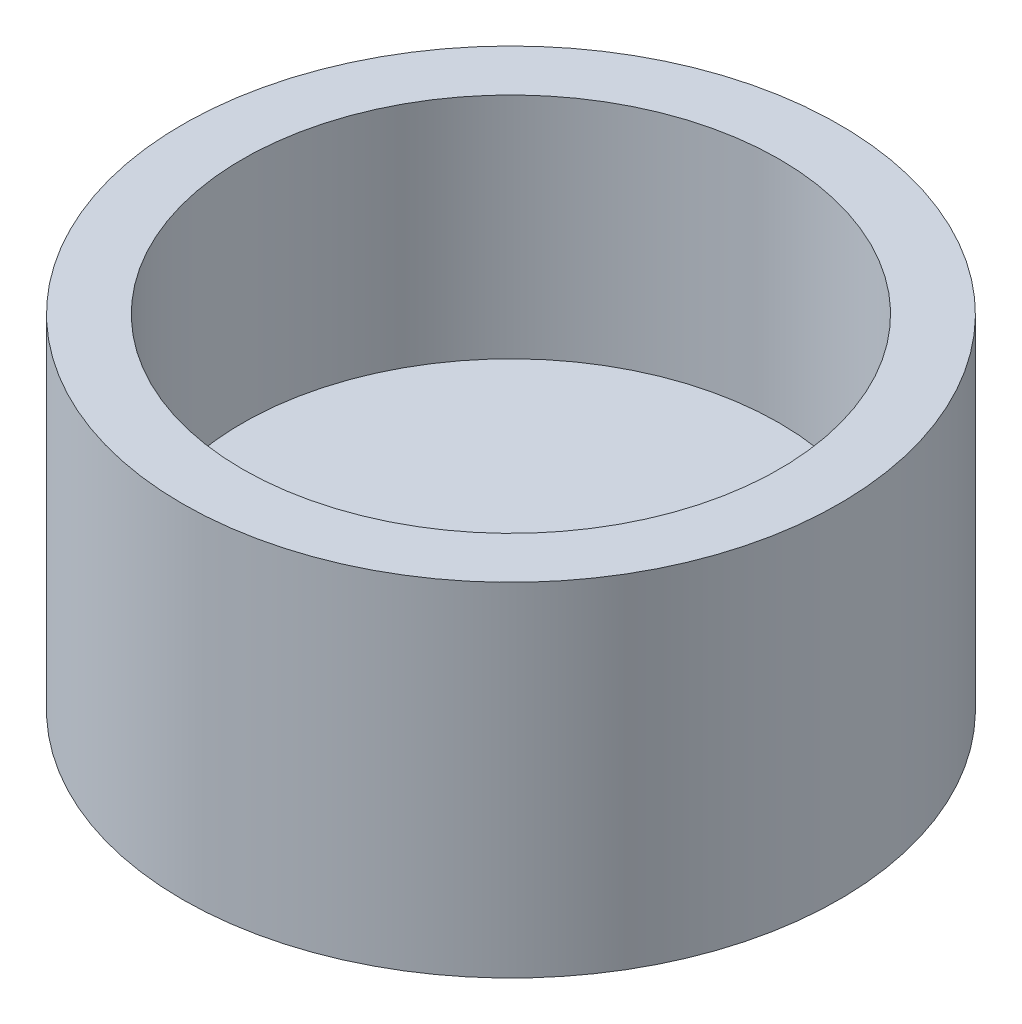
ISO-10303-21;
HEADER;
FILE_DESCRIPTION(('STEP AP214'),'2;1');
FILE_NAME('part.step','',(''),(''),'','','');
FILE_SCHEMA(('AUTOMOTIVE_DESIGN { 1 0 10303 214 1 1 1 1 }'));
ENDSEC;
DATA;
#1=APPLICATION_CONTEXT('core data for automotive mechanical design processes');
#2=APPLICATION_PROTOCOL_DEFINITION('international standard','automotive_design',2000,#1);
#3=PRODUCT_CONTEXT('',#1,'mechanical');
#4=PRODUCT('Part','Part','',(#3));
#5=PRODUCT_RELATED_PRODUCT_CATEGORY('part','',(#4));
#6=PRODUCT_DEFINITION_FORMATION('','',#4);
#7=PRODUCT_DEFINITION_CONTEXT('part definition',#1,'design');
#8=PRODUCT_DEFINITION('design','',#6,#7);
#9=PRODUCT_DEFINITION_SHAPE('','',#8);
#10=(LENGTH_UNIT() NAMED_UNIT(*) SI_UNIT(.MILLI.,.METRE.));
#11=(NAMED_UNIT(*) PLANE_ANGLE_UNIT() SI_UNIT($,.RADIAN.));
#12=(NAMED_UNIT(*) SI_UNIT($,.STERADIAN.) SOLID_ANGLE_UNIT());
#13=UNCERTAINTY_MEASURE_WITH_UNIT(LENGTH_MEASURE(1.E-05),#10,'distance_accuracy_value','');
#14=(GEOMETRIC_REPRESENTATION_CONTEXT(3) GLOBAL_UNCERTAINTY_ASSIGNED_CONTEXT((#13)) GLOBAL_UNIT_ASSIGNED_CONTEXT((#10,
#11,#12)) REPRESENTATION_CONTEXT('',''));
#15=CARTESIAN_POINT('',(0.,0.,0.));
#16=DIRECTION('',(0.,0.,1.));
#17=DIRECTION('',(1.,0.,0.));
#18=AXIS2_PLACEMENT_3D('',#15,#16,#17);
#19=CARTESIAN_POINT('',(0.,6.,0.));
#20=DIRECTION('',(0.,-1.,0.));
#21=DIRECTION('',(0.,0.,-1.));
#22=AXIS2_PLACEMENT_3D('',#19,#20,#21);
#23=CYLINDRICAL_SURFACE('',#22,5.75);
#24=CARTESIAN_POINT('',(0.,6.,0.));
#25=DIRECTION('',(0.,1.,0.));
#26=DIRECTION('',(0.,0.,1.));
#27=AXIS2_PLACEMENT_3D('',#24,#25,#26);
#28=CIRCLE('',#27,5.75);
#29=CARTESIAN_POINT('',(0.,6.,5.75));
#30=VERTEX_POINT('',#29);
#31=EDGE_CURVE('E10',#30,#30,#28,.T.);
#32=ORIENTED_EDGE('',*,*,#31,.F.);
#33=EDGE_LOOP('',(#32));
#34=FACE_BOUND('',#33,.T.);
#35=CARTESIAN_POINT('',(0.,0.,0.));
#36=DIRECTION('',(0.,1.,0.));
#37=DIRECTION('',(0.,0.,1.));
#38=AXIS2_PLACEMENT_3D('',#35,#36,#37);
#39=CIRCLE('',#38,5.75);
#40=CARTESIAN_POINT('',(0.,0.,5.75));
#41=VERTEX_POINT('',#40);
#42=EDGE_CURVE('E38',#41,#41,#39,.T.);
#43=ORIENTED_EDGE('',*,*,#42,.T.);
#44=EDGE_LOOP('',(#43));
#45=FACE_BOUND('',#44,.T.);
#46=ADVANCED_FACE('F35',(#34,#45),#23,.T.);
#47=CARTESIAN_POINT('',(0.,6.,0.));
#48=DIRECTION('',(0.,1.,0.));
#49=DIRECTION('',(0.,0.,1.));
#50=AXIS2_PLACEMENT_3D('',#47,#48,#49);
#51=PLANE('',#50);
#52=CARTESIAN_POINT('',(0.,6.,0.));
#53=DIRECTION('',(0.,1.,0.));
#54=DIRECTION('',(0.,0.,1.));
#55=AXIS2_PLACEMENT_3D('',#52,#53,#54);
#56=CIRCLE('',#55,4.7);
#57=CARTESIAN_POINT('',(0.,6.,4.7));
#58=VERTEX_POINT('',#57);
#59=EDGE_CURVE('E47',#58,#58,#56,.T.);
#60=ORIENTED_EDGE('',*,*,#59,.F.);
#61=EDGE_LOOP('',(#60));
#62=FACE_BOUND('',#61,.T.);
#63=ORIENTED_EDGE('',*,*,#31,.T.);
#64=EDGE_LOOP('',(#63));
#65=FACE_BOUND('',#64,.T.);
#66=ADVANCED_FACE('F62',(#62,#65),#51,.T.);
#67=CARTESIAN_POINT('',(0.,0.,0.));
#68=DIRECTION('',(0.,1.,0.));
#69=DIRECTION('',(0.,0.,1.));
#70=AXIS2_PLACEMENT_3D('',#67,#68,#69);
#71=PLANE('',#70);
#72=ORIENTED_EDGE('',*,*,#42,.F.);
#73=EDGE_LOOP('',(#72));
#74=FACE_BOUND('',#73,.T.);
#75=ADVANCED_FACE('F58',(#74),#71,.F.);
#76=CARTESIAN_POINT('',(0.,2.,0.));
#77=DIRECTION('',(0.,1.,0.));
#78=DIRECTION('',(0.,0.,1.));
#79=AXIS2_PLACEMENT_3D('',#76,#77,#78);
#80=CYLINDRICAL_SURFACE('',#79,4.7);
#81=CARTESIAN_POINT('',(0.,2.,0.));
#82=DIRECTION('',(0.,1.,0.));
#83=DIRECTION('',(0.,0.,1.));
#84=AXIS2_PLACEMENT_3D('',#81,#82,#83);
#85=CIRCLE('',#84,4.7);
#86=CARTESIAN_POINT('',(0.,2.,4.7));
#87=VERTEX_POINT('',#86);
#88=EDGE_CURVE('E45',#87,#87,#85,.T.);
#89=ORIENTED_EDGE('',*,*,#88,.F.);
#90=EDGE_LOOP('',(#89));
#91=FACE_BOUND('',#90,.T.);
#92=ORIENTED_EDGE('',*,*,#59,.T.);
#93=EDGE_LOOP('',(#92));
#94=FACE_BOUND('',#93,.T.);
#95=ADVANCED_FACE('F55',(#91,#94),#80,.F.);
#96=CARTESIAN_POINT('',(0.,2.,0.));
#97=DIRECTION('',(0.,1.,0.));
#98=DIRECTION('',(0.,0.,1.));
#99=AXIS2_PLACEMENT_3D('',#96,#97,#98);
#100=PLANE('',#99);
#101=ORIENTED_EDGE('',*,*,#88,.T.);
#102=EDGE_LOOP('',(#101));
#103=FACE_BOUND('',#102,.T.);
#104=ADVANCED_FACE('F53',(#103),#100,.T.);
#105=CLOSED_SHELL('',(#46,#66,#75,#95,#104));
#106=MANIFOLD_SOLID_BREP('B2',#105);
#107=ADVANCED_BREP_SHAPE_REPRESENTATION('',(#18,#106),#14);
#108=SHAPE_DEFINITION_REPRESENTATION(#9,#107);
ENDSEC;
END-ISO-10303-21;
